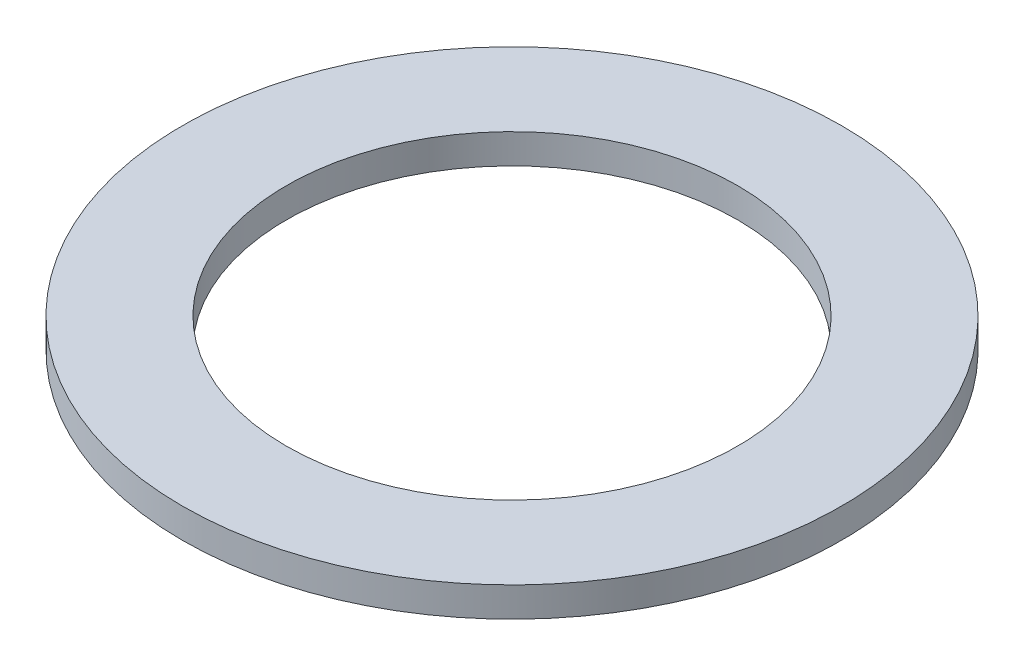
ISO-10303-21;
HEADER;
FILE_DESCRIPTION(('STEP AP214'),'2;1');
FILE_NAME('part.step','',(''),(''),'','','');
FILE_SCHEMA(('AUTOMOTIVE_DESIGN { 1 0 10303 214 1 1 1 1 }'));
ENDSEC;
DATA;
#1=APPLICATION_CONTEXT('core data for automotive mechanical design processes');
#2=APPLICATION_PROTOCOL_DEFINITION('international standard','automotive_design',2000,#1);
#3=PRODUCT_CONTEXT('',#1,'mechanical');
#4=PRODUCT('Part','Part','',(#3));
#5=PRODUCT_RELATED_PRODUCT_CATEGORY('part','',(#4));
#6=PRODUCT_DEFINITION_FORMATION('','',#4);
#7=PRODUCT_DEFINITION_CONTEXT('part definition',#1,'design');
#8=PRODUCT_DEFINITION('design','',#6,#7);
#9=PRODUCT_DEFINITION_SHAPE('','',#8);
#10=(LENGTH_UNIT() NAMED_UNIT(*) SI_UNIT(.MILLI.,.METRE.));
#11=(NAMED_UNIT(*) PLANE_ANGLE_UNIT() SI_UNIT($,.RADIAN.));
#12=(NAMED_UNIT(*) SI_UNIT($,.STERADIAN.) SOLID_ANGLE_UNIT());
#13=UNCERTAINTY_MEASURE_WITH_UNIT(LENGTH_MEASURE(1.E-05),#10,'distance_accuracy_value','');
#14=(GEOMETRIC_REPRESENTATION_CONTEXT(3) GLOBAL_UNCERTAINTY_ASSIGNED_CONTEXT((#13)) GLOBAL_UNIT_ASSIGNED_CONTEXT((#10,
#11,#12)) REPRESENTATION_CONTEXT('',''));
#15=CARTESIAN_POINT('',(0.,0.,0.));
#16=DIRECTION('',(0.,0.,1.));
#17=DIRECTION('',(1.,0.,0.));
#18=AXIS2_PLACEMENT_3D('',#15,#16,#17);
#19=CARTESIAN_POINT('',(0.,0.,0.));
#20=DIRECTION('',(0.,-1.,0.));
#21=DIRECTION('',(0.,0.,-1.));
#22=AXIS2_PLACEMENT_3D('',#19,#20,#21);
#23=CYLINDRICAL_SURFACE('',#22,11.1);
#24=CARTESIAN_POINT('',(0.,0.,0.));
#25=DIRECTION('',(0.,-1.,0.));
#26=DIRECTION('',(0.,0.,-1.));
#27=AXIS2_PLACEMENT_3D('',#24,#25,#26);
#28=CIRCLE('',#27,11.1);
#29=CARTESIAN_POINT('',(0.,0.,-11.1));
#30=VERTEX_POINT('',#29);
#31=EDGE_CURVE('E10',#30,#30,#28,.T.);
#32=ORIENTED_EDGE('',*,*,#31,.F.);
#33=EDGE_LOOP('',(#32));
#34=FACE_BOUND('',#33,.T.);
#35=CARTESIAN_POINT('',(0.,0.999999999999999,0.));
#36=DIRECTION('',(0.,-1.,0.));
#37=DIRECTION('',(0.,0.,-1.));
#38=AXIS2_PLACEMENT_3D('',#35,#36,#37);
#39=CIRCLE('',#38,11.1);
#40=CARTESIAN_POINT('',(0.,0.999999999999999,-11.1));
#41=VERTEX_POINT('',#40);
#42=EDGE_CURVE('E47',#41,#41,#39,.T.);
#43=ORIENTED_EDGE('',*,*,#42,.T.);
#44=EDGE_LOOP('',(#43));
#45=FACE_BOUND('',#44,.T.);
#46=ADVANCED_FACE('F33',(#34,#45),#23,.T.);
#47=CARTESIAN_POINT('',(-11.1,0.,0.));
#48=DIRECTION('',(0.,1.,0.));
#49=DIRECTION('',(0.,0.,1.));
#50=AXIS2_PLACEMENT_3D('',#47,#48,#49);
#51=PLANE('',#50);
#52=CARTESIAN_POINT('',(0.,0.,0.));
#53=DIRECTION('',(0.,-1.,0.));
#54=DIRECTION('',(0.,0.,-1.));
#55=AXIS2_PLACEMENT_3D('',#52,#53,#54);
#56=CIRCLE('',#55,7.6);
#57=CARTESIAN_POINT('',(0.,0.,-7.6));
#58=VERTEX_POINT('',#57);
#59=EDGE_CURVE('E39',#58,#58,#56,.T.);
#60=ORIENTED_EDGE('',*,*,#59,.F.);
#61=EDGE_LOOP('',(#60));
#62=FACE_BOUND('',#61,.T.);
#63=ORIENTED_EDGE('',*,*,#31,.T.);
#64=EDGE_LOOP('',(#63));
#65=FACE_BOUND('',#64,.T.);
#66=ADVANCED_FACE('F62',(#62,#65),#51,.F.);
#67=CARTESIAN_POINT('',(0.,0.,0.));
#68=DIRECTION('',(0.,-1.,0.));
#69=DIRECTION('',(0.,0.,-1.));
#70=AXIS2_PLACEMENT_3D('',#67,#68,#69);
#71=CYLINDRICAL_SURFACE('',#70,7.6);
#72=CARTESIAN_POINT('',(0.,0.999999999999999,0.));
#73=DIRECTION('',(0.,-1.,0.));
#74=DIRECTION('',(0.,0.,-1.));
#75=AXIS2_PLACEMENT_3D('',#72,#73,#74);
#76=CIRCLE('',#75,7.6);
#77=CARTESIAN_POINT('',(0.,0.999999999999999,-7.6));
#78=VERTEX_POINT('',#77);
#79=EDGE_CURVE('E43',#78,#78,#76,.T.);
#80=ORIENTED_EDGE('',*,*,#79,.F.);
#81=EDGE_LOOP('',(#80));
#82=FACE_BOUND('',#81,.T.);
#83=ORIENTED_EDGE('',*,*,#59,.T.);
#84=EDGE_LOOP('',(#83));
#85=FACE_BOUND('',#84,.T.);
#86=ADVANCED_FACE('F57',(#82,#85),#71,.F.);
#87=CARTESIAN_POINT('',(-7.6,0.999999999999999,0.));
#88=DIRECTION('',(0.,-1.,0.));
#89=DIRECTION('',(0.,0.,-1.));
#90=AXIS2_PLACEMENT_3D('',#87,#88,#89);
#91=PLANE('',#90);
#92=ORIENTED_EDGE('',*,*,#42,.F.);
#93=EDGE_LOOP('',(#92));
#94=FACE_BOUND('',#93,.T.);
#95=ORIENTED_EDGE('',*,*,#79,.T.);
#96=EDGE_LOOP('',(#95));
#97=FACE_BOUND('',#96,.T.);
#98=ADVANCED_FACE('F54',(#94,#97),#91,.F.);
#99=CLOSED_SHELL('',(#46,#66,#86,#98));
#100=MANIFOLD_SOLID_BREP('B2',#99);
#101=ADVANCED_BREP_SHAPE_REPRESENTATION('',(#18,#100),#14);
#102=SHAPE_DEFINITION_REPRESENTATION(#9,#101);
ENDSEC;
END-ISO-10303-21;
